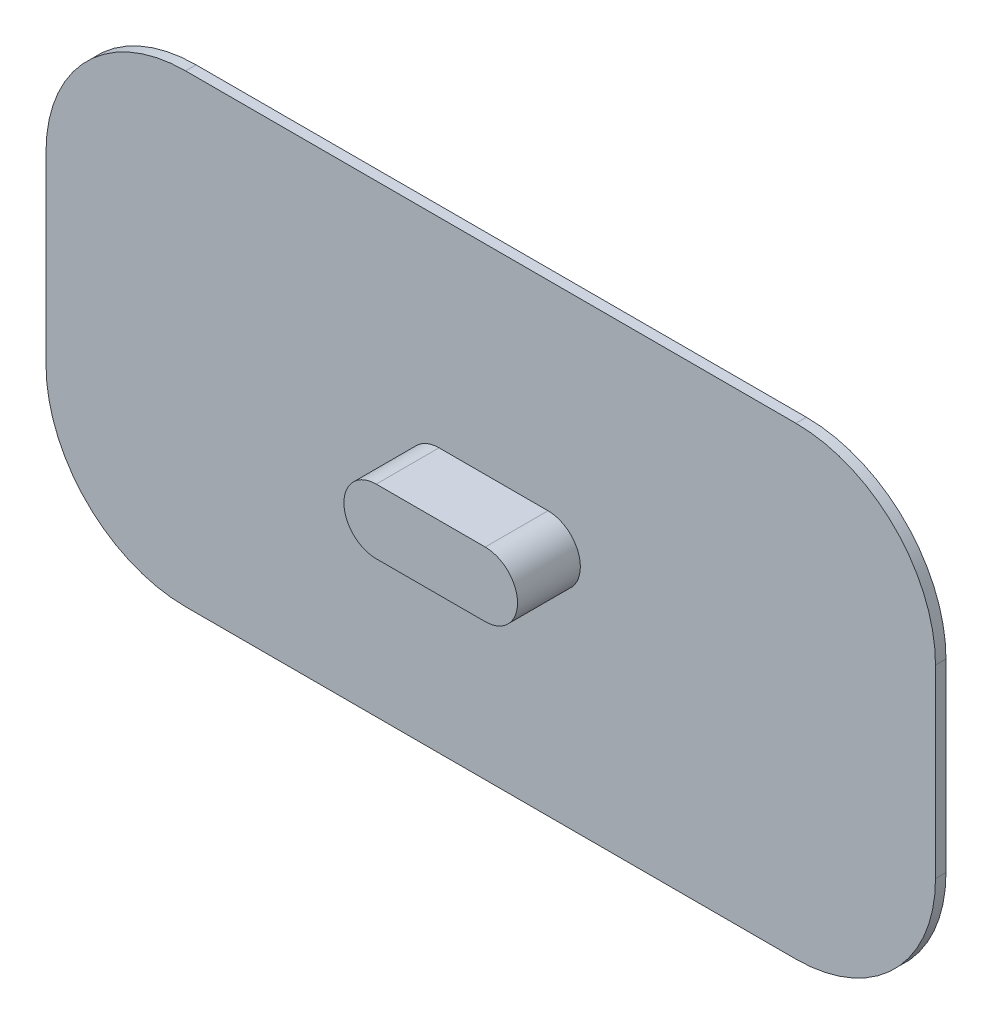
ISO-10303-21;
HEADER;
FILE_DESCRIPTION(('STEP AP214'),'2;1');
FILE_NAME('part.step','',(''),(''),'','','');
FILE_SCHEMA(('AUTOMOTIVE_DESIGN { 1 0 10303 214 1 1 1 1 }'));
ENDSEC;
DATA;
#1=APPLICATION_CONTEXT('core data for automotive mechanical design processes');
#2=APPLICATION_PROTOCOL_DEFINITION('international standard','automotive_design',2000,#1);
#3=PRODUCT_CONTEXT('',#1,'mechanical');
#4=PRODUCT('Part','Part','',(#3));
#5=PRODUCT_RELATED_PRODUCT_CATEGORY('part','',(#4));
#6=PRODUCT_DEFINITION_FORMATION('','',#4);
#7=PRODUCT_DEFINITION_CONTEXT('part definition',#1,'design');
#8=PRODUCT_DEFINITION('design','',#6,#7);
#9=PRODUCT_DEFINITION_SHAPE('','',#8);
#10=(LENGTH_UNIT() NAMED_UNIT(*) SI_UNIT(.MILLI.,.METRE.));
#11=(NAMED_UNIT(*) PLANE_ANGLE_UNIT() SI_UNIT($,.RADIAN.));
#12=(NAMED_UNIT(*) SI_UNIT($,.STERADIAN.) SOLID_ANGLE_UNIT());
#13=UNCERTAINTY_MEASURE_WITH_UNIT(LENGTH_MEASURE(1.E-05),#10,'distance_accuracy_value','');
#14=(GEOMETRIC_REPRESENTATION_CONTEXT(3) GLOBAL_UNCERTAINTY_ASSIGNED_CONTEXT((#13)) GLOBAL_UNIT_ASSIGNED_CONTEXT((#10,
#11,#12)) REPRESENTATION_CONTEXT('',''));
#15=CARTESIAN_POINT('',(0.,0.,0.));
#16=DIRECTION('',(0.,0.,1.));
#17=DIRECTION('',(1.,0.,0.));
#18=AXIS2_PLACEMENT_3D('',#15,#16,#17);
#19=CARTESIAN_POINT('',(-127.45,26.5,3.));
#20=DIRECTION('',(1.,0.,0.));
#21=DIRECTION('',(0.,0.,-1.));
#22=AXIS2_PLACEMENT_3D('',#19,#20,#21);
#23=PLANE('',#22);
#24=DIRECTION('',(0.,-1.,0.));
#25=VECTOR('',#24,1.);
#26=CARTESIAN_POINT('',(-127.45,26.5,0.));
#27=LINE('',#26,#25);
#28=CARTESIAN_POINT('',(-127.45,26.5,0.));
#29=VERTEX_POINT('',#28);
#30=CARTESIAN_POINT('',(-127.45,-26.5,0.));
#31=VERTEX_POINT('',#30);
#32=EDGE_CURVE('E143',#29,#31,#27,.T.);
#33=ORIENTED_EDGE('',*,*,#32,.T.);
#34=DIRECTION('',(0.,0.,-1.));
#35=VECTOR('',#34,1.);
#36=CARTESIAN_POINT('',(-127.45,-26.5,3.));
#37=LINE('',#36,#35);
#38=CARTESIAN_POINT('',(-127.45,-26.5,3.));
#39=VERTEX_POINT('',#38);
#40=EDGE_CURVE('E11',#39,#31,#37,.T.);
#41=ORIENTED_EDGE('',*,*,#40,.F.);
#42=DIRECTION('',(0.,-1.,0.));
#43=VECTOR('',#42,1.);
#44=CARTESIAN_POINT('',(-127.45,26.5,3.));
#45=LINE('',#44,#43);
#46=CARTESIAN_POINT('',(-127.45,26.5,3.));
#47=VERTEX_POINT('',#46);
#48=EDGE_CURVE('E152',#47,#39,#45,.T.);
#49=ORIENTED_EDGE('',*,*,#48,.F.);
#50=DIRECTION('',(0.,0.,-1.));
#51=VECTOR('',#50,1.);
#52=CARTESIAN_POINT('',(-127.45,26.5,3.));
#53=LINE('',#52,#51);
#54=EDGE_CURVE('E169',#47,#29,#53,.T.);
#55=ORIENTED_EDGE('',*,*,#54,.T.);
#56=EDGE_LOOP('',(#33,#41,#49,#55));
#57=FACE_BOUND('',#56,.T.);
#58=ADVANCED_FACE('F35',(#57),#23,.F.);
#59=CARTESIAN_POINT('',(-87.45,-26.5,3.));
#60=DIRECTION('',(0.,0.,-1.));
#61=DIRECTION('',(-1.,0.,0.));
#62=AXIS2_PLACEMENT_3D('',#59,#60,#61);
#63=CYLINDRICAL_SURFACE('',#62,40.);
#64=CARTESIAN_POINT('',(-87.45,-26.5,0.));
#65=DIRECTION('',(0.,0.,1.));
#66=DIRECTION('',(1.,0.,0.));
#67=AXIS2_PLACEMENT_3D('',#64,#65,#66);
#68=CIRCLE('',#67,40.);
#69=CARTESIAN_POINT('',(-87.45,-66.5,0.));
#70=VERTEX_POINT('',#69);
#71=EDGE_CURVE('E146',#31,#70,#68,.T.);
#72=ORIENTED_EDGE('',*,*,#71,.T.);
#73=DIRECTION('',(0.,0.,-1.));
#74=VECTOR('',#73,1.);
#75=CARTESIAN_POINT('',(-87.45,-66.5,3.));
#76=LINE('',#75,#74);
#77=CARTESIAN_POINT('',(-87.45,-66.5,3.));
#78=VERTEX_POINT('',#77);
#79=EDGE_CURVE('E42',#78,#70,#76,.T.);
#80=ORIENTED_EDGE('',*,*,#79,.F.);
#81=CARTESIAN_POINT('',(-87.45,-26.5,3.));
#82=DIRECTION('',(0.,0.,1.));
#83=DIRECTION('',(1.,0.,0.));
#84=AXIS2_PLACEMENT_3D('',#81,#82,#83);
#85=CIRCLE('',#84,40.);
#86=EDGE_CURVE('E155',#39,#78,#85,.T.);
#87=ORIENTED_EDGE('',*,*,#86,.F.);
#88=ORIENTED_EDGE('',*,*,#40,.T.);
#89=EDGE_LOOP('',(#72,#80,#87,#88));
#90=FACE_BOUND('',#89,.T.);
#91=ADVANCED_FACE('F227',(#90),#63,.T.);
#92=CARTESIAN_POINT('',(-87.45,-66.5,3.));
#93=DIRECTION('',(0.,1.,0.));
#94=DIRECTION('',(0.,0.,1.));
#95=AXIS2_PLACEMENT_3D('',#92,#93,#94);
#96=PLANE('',#95);
#97=DIRECTION('',(1.,0.,0.));
#98=VECTOR('',#97,1.);
#99=CARTESIAN_POINT('',(-87.45,-66.5,0.));
#100=LINE('',#99,#98);
#101=CARTESIAN_POINT('',(87.45,-66.5,0.));
#102=VERTEX_POINT('',#101);
#103=EDGE_CURVE('E172',#70,#102,#100,.T.);
#104=ORIENTED_EDGE('',*,*,#103,.T.);
#105=DIRECTION('',(0.,0.,-1.));
#106=VECTOR('',#105,1.);
#107=CARTESIAN_POINT('',(87.45,-66.5,3.));
#108=LINE('',#107,#106);
#109=CARTESIAN_POINT('',(87.45,-66.5,3.));
#110=VERTEX_POINT('',#109);
#111=EDGE_CURVE('E197',#110,#102,#108,.T.);
#112=ORIENTED_EDGE('',*,*,#111,.F.);
#113=DIRECTION('',(1.,0.,0.));
#114=VECTOR('',#113,1.);
#115=CARTESIAN_POINT('',(-87.45,-66.5,3.));
#116=LINE('',#115,#114);
#117=EDGE_CURVE('E158',#78,#110,#116,.T.);
#118=ORIENTED_EDGE('',*,*,#117,.F.);
#119=ORIENTED_EDGE('',*,*,#79,.T.);
#120=EDGE_LOOP('',(#104,#112,#118,#119));
#121=FACE_BOUND('',#120,.T.);
#122=ADVANCED_FACE('F204',(#121),#96,.F.);
#123=CARTESIAN_POINT('',(87.45,-26.5,3.));
#124=DIRECTION('',(0.,0.,-1.));
#125=DIRECTION('',(-1.,0.,0.));
#126=AXIS2_PLACEMENT_3D('',#123,#124,#125);
#127=CYLINDRICAL_SURFACE('',#126,40.);
#128=CARTESIAN_POINT('',(87.45,-26.5,0.));
#129=DIRECTION('',(0.,0.,1.));
#130=DIRECTION('',(1.,0.,0.));
#131=AXIS2_PLACEMENT_3D('',#128,#129,#130);
#132=CIRCLE('',#131,40.);
#133=CARTESIAN_POINT('',(127.45,-26.5,0.));
#134=VERTEX_POINT('',#133);
#135=EDGE_CURVE('E174',#102,#134,#132,.T.);
#136=ORIENTED_EDGE('',*,*,#135,.T.);
#137=DIRECTION('',(0.,0.,-1.));
#138=VECTOR('',#137,1.);
#139=CARTESIAN_POINT('',(127.45,-26.5,3.));
#140=LINE('',#139,#138);
#141=CARTESIAN_POINT('',(127.45,-26.5,3.));
#142=VERTEX_POINT('',#141);
#143=EDGE_CURVE('E194',#142,#134,#140,.T.);
#144=ORIENTED_EDGE('',*,*,#143,.F.);
#145=CARTESIAN_POINT('',(87.45,-26.5,3.));
#146=DIRECTION('',(0.,0.,1.));
#147=DIRECTION('',(1.,0.,0.));
#148=AXIS2_PLACEMENT_3D('',#145,#146,#147);
#149=CIRCLE('',#148,40.);
#150=EDGE_CURVE('E160',#110,#142,#149,.T.);
#151=ORIENTED_EDGE('',*,*,#150,.F.);
#152=ORIENTED_EDGE('',*,*,#111,.T.);
#153=EDGE_LOOP('',(#136,#144,#151,#152));
#154=FACE_BOUND('',#153,.T.);
#155=ADVANCED_FACE('F215',(#154),#127,.T.);
#156=CARTESIAN_POINT('',(127.45,-26.5,3.));
#157=DIRECTION('',(-1.,0.,0.));
#158=DIRECTION('',(0.,0.,1.));
#159=AXIS2_PLACEMENT_3D('',#156,#157,#158);
#160=PLANE('',#159);
#161=DIRECTION('',(0.,1.,0.));
#162=VECTOR('',#161,1.);
#163=CARTESIAN_POINT('',(127.45,-26.5,0.));
#164=LINE('',#163,#162);
#165=CARTESIAN_POINT('',(127.45,26.5,0.));
#166=VERTEX_POINT('',#165);
#167=EDGE_CURVE('E176',#134,#166,#164,.T.);
#168=ORIENTED_EDGE('',*,*,#167,.T.);
#169=DIRECTION('',(0.,0.,-1.));
#170=VECTOR('',#169,1.);
#171=CARTESIAN_POINT('',(127.45,26.5,3.));
#172=LINE('',#171,#170);
#173=CARTESIAN_POINT('',(127.45,26.5,3.));
#174=VERTEX_POINT('',#173);
#175=EDGE_CURVE('E191',#174,#166,#172,.T.);
#176=ORIENTED_EDGE('',*,*,#175,.F.);
#177=DIRECTION('',(0.,1.,0.));
#178=VECTOR('',#177,1.);
#179=CARTESIAN_POINT('',(127.45,-26.5,3.));
#180=LINE('',#179,#178);
#181=EDGE_CURVE('E162',#142,#174,#180,.T.);
#182=ORIENTED_EDGE('',*,*,#181,.F.);
#183=ORIENTED_EDGE('',*,*,#143,.T.);
#184=EDGE_LOOP('',(#168,#176,#182,#183));
#185=FACE_BOUND('',#184,.T.);
#186=ADVANCED_FACE('F219',(#185),#160,.F.);
#187=CARTESIAN_POINT('',(87.45,26.5,3.));
#188=DIRECTION('',(0.,0.,-1.));
#189=DIRECTION('',(-1.,0.,0.));
#190=AXIS2_PLACEMENT_3D('',#187,#188,#189);
#191=CYLINDRICAL_SURFACE('',#190,40.);
#192=CARTESIAN_POINT('',(87.45,26.5,0.));
#193=DIRECTION('',(0.,0.,1.));
#194=DIRECTION('',(1.,0.,0.));
#195=AXIS2_PLACEMENT_3D('',#192,#193,#194);
#196=CIRCLE('',#195,40.);
#197=CARTESIAN_POINT('',(87.45,66.5,0.));
#198=VERTEX_POINT('',#197);
#199=EDGE_CURVE('E178',#166,#198,#196,.T.);
#200=ORIENTED_EDGE('',*,*,#199,.T.);
#201=DIRECTION('',(0.,0.,-1.));
#202=VECTOR('',#201,1.);
#203=CARTESIAN_POINT('',(87.45,66.5,3.));
#204=LINE('',#203,#202);
#205=CARTESIAN_POINT('',(87.45,66.5,3.));
#206=VERTEX_POINT('',#205);
#207=EDGE_CURVE('E188',#206,#198,#204,.T.);
#208=ORIENTED_EDGE('',*,*,#207,.F.);
#209=CARTESIAN_POINT('',(87.45,26.5,3.));
#210=DIRECTION('',(0.,0.,1.));
#211=DIRECTION('',(1.,0.,0.));
#212=AXIS2_PLACEMENT_3D('',#209,#210,#211);
#213=CIRCLE('',#212,40.);
#214=EDGE_CURVE('E164',#174,#206,#213,.T.);
#215=ORIENTED_EDGE('',*,*,#214,.F.);
#216=ORIENTED_EDGE('',*,*,#175,.T.);
#217=EDGE_LOOP('',(#200,#208,#215,#216));
#218=FACE_BOUND('',#217,.T.);
#219=ADVANCED_FACE('F240',(#218),#191,.T.);
#220=CARTESIAN_POINT('',(87.45,66.5,3.));
#221=DIRECTION('',(0.,-1.,0.));
#222=DIRECTION('',(0.,0.,-1.));
#223=AXIS2_PLACEMENT_3D('',#220,#221,#222);
#224=PLANE('',#223);
#225=DIRECTION('',(-1.,0.,0.));
#226=VECTOR('',#225,1.);
#227=CARTESIAN_POINT('',(87.45,66.5,0.));
#228=LINE('',#227,#226);
#229=CARTESIAN_POINT('',(-87.45,66.5,0.));
#230=VERTEX_POINT('',#229);
#231=EDGE_CURVE('E180',#198,#230,#228,.T.);
#232=ORIENTED_EDGE('',*,*,#231,.T.);
#233=DIRECTION('',(0.,0.,-1.));
#234=VECTOR('',#233,1.);
#235=CARTESIAN_POINT('',(-87.45,66.5,3.));
#236=LINE('',#235,#234);
#237=CARTESIAN_POINT('',(-87.45,66.5,3.));
#238=VERTEX_POINT('',#237);
#239=EDGE_CURVE('E185',#238,#230,#236,.T.);
#240=ORIENTED_EDGE('',*,*,#239,.F.);
#241=DIRECTION('',(-1.,0.,0.));
#242=VECTOR('',#241,1.);
#243=CARTESIAN_POINT('',(87.45,66.5,3.));
#244=LINE('',#243,#242);
#245=EDGE_CURVE('E166',#206,#238,#244,.T.);
#246=ORIENTED_EDGE('',*,*,#245,.F.);
#247=ORIENTED_EDGE('',*,*,#207,.T.);
#248=EDGE_LOOP('',(#232,#240,#246,#247));
#249=FACE_BOUND('',#248,.T.);
#250=ADVANCED_FACE('F238',(#249),#224,.F.);
#251=CARTESIAN_POINT('',(-87.45,26.5,3.));
#252=DIRECTION('',(0.,0.,-1.));
#253=DIRECTION('',(-1.,0.,0.));
#254=AXIS2_PLACEMENT_3D('',#251,#252,#253);
#255=CYLINDRICAL_SURFACE('',#254,40.);
#256=CARTESIAN_POINT('',(-87.45,26.5,0.));
#257=DIRECTION('',(0.,0.,1.));
#258=DIRECTION('',(1.,0.,0.));
#259=AXIS2_PLACEMENT_3D('',#256,#257,#258);
#260=CIRCLE('',#259,40.);
#261=EDGE_CURVE('E156',#230,#29,#260,.T.);
#262=ORIENTED_EDGE('',*,*,#261,.T.);
#263=ORIENTED_EDGE('',*,*,#54,.F.);
#264=CARTESIAN_POINT('',(-87.45,26.5,3.));
#265=DIRECTION('',(0.,0.,1.));
#266=DIRECTION('',(1.,0.,0.));
#267=AXIS2_PLACEMENT_3D('',#264,#265,#266);
#268=CIRCLE('',#267,40.);
#269=EDGE_CURVE('E168',#238,#47,#268,.T.);
#270=ORIENTED_EDGE('',*,*,#269,.F.);
#271=ORIENTED_EDGE('',*,*,#239,.T.);
#272=EDGE_LOOP('',(#262,#263,#270,#271));
#273=FACE_BOUND('',#272,.T.);
#274=ADVANCED_FACE('F233',(#273),#255,.T.);
#275=CARTESIAN_POINT('',(-87.45,-26.5,3.));
#276=DIRECTION('',(0.,0.,1.));
#277=DIRECTION('',(1.,0.,0.));
#278=AXIS2_PLACEMENT_3D('',#275,#276,#277);
#279=PLANE('',#278);
#280=CARTESIAN_POINT('',(-14.8218267329379,0.,3.));
#281=DIRECTION('',(0.,0.,1.));
#282=DIRECTION('',(1.,0.,0.));
#283=AXIS2_PLACEMENT_3D('',#280,#281,#282);
#284=CIRCLE('',#283,9.26364170808615);
#285=CARTESIAN_POINT('',(-14.8218267329379,9.26364170808615,3.));
#286=VERTEX_POINT('',#285);
#287=CARTESIAN_POINT('',(-14.8218267329379,-9.26364170808615,3.));
#288=VERTEX_POINT('',#287);
#289=EDGE_CURVE('E49',#286,#288,#284,.T.);
#290=ORIENTED_EDGE('',*,*,#289,.F.);
#291=DIRECTION('',(-1.,0.,0.));
#292=VECTOR('',#291,1.);
#293=CARTESIAN_POINT('',(-14.8218267329379,9.26364170808615,3.));
#294=LINE('',#293,#292);
#295=CARTESIAN_POINT('',(16.4098795971812,9.26364170808615,3.));
#296=VERTEX_POINT('',#295);
#297=EDGE_CURVE('E53',#296,#286,#294,.T.);
#298=ORIENTED_EDGE('',*,*,#297,.F.);
#299=CARTESIAN_POINT('',(16.4098795971812,0.,3.));
#300=DIRECTION('',(0.,0.,1.));
#301=DIRECTION('',(1.,0.,0.));
#302=AXIS2_PLACEMENT_3D('',#299,#300,#301);
#303=CIRCLE('',#302,9.26364170808615);
#304=CARTESIAN_POINT('',(16.4098795971812,-9.26364170808615,3.));
#305=VERTEX_POINT('',#304);
#306=EDGE_CURVE('E352',#305,#296,#303,.T.);
#307=ORIENTED_EDGE('',*,*,#306,.F.);
#308=DIRECTION('',(1.,0.,0.));
#309=VECTOR('',#308,1.);
#310=CARTESIAN_POINT('',(-14.8218267329379,-9.26364170808615,3.));
#311=LINE('',#310,#309);
#312=EDGE_CURVE('E358',#288,#305,#311,.T.);
#313=ORIENTED_EDGE('',*,*,#312,.F.);
#314=EDGE_LOOP('',(#290,#298,#307,#313));
#315=FACE_BOUND('',#314,.T.);
#316=ORIENTED_EDGE('',*,*,#48,.T.);
#317=ORIENTED_EDGE('',*,*,#86,.T.);
#318=ORIENTED_EDGE('',*,*,#117,.T.);
#319=ORIENTED_EDGE('',*,*,#150,.T.);
#320=ORIENTED_EDGE('',*,*,#181,.T.);
#321=ORIENTED_EDGE('',*,*,#214,.T.);
#322=ORIENTED_EDGE('',*,*,#245,.T.);
#323=ORIENTED_EDGE('',*,*,#269,.T.);
#324=EDGE_LOOP('',(#316,#317,#318,#319,#320,#321,#322,#323));
#325=FACE_BOUND('',#324,.T.);
#326=ADVANCED_FACE('F223',(#315,#325),#279,.T.);
#327=CARTESIAN_POINT('',(-87.45,-26.5,0.));
#328=DIRECTION('',(0.,0.,1.));
#329=DIRECTION('',(1.,0.,0.));
#330=AXIS2_PLACEMENT_3D('',#327,#328,#329);
#331=PLANE('',#330);
#332=ORIENTED_EDGE('',*,*,#32,.F.);
#333=ORIENTED_EDGE('',*,*,#261,.F.);
#334=ORIENTED_EDGE('',*,*,#231,.F.);
#335=ORIENTED_EDGE('',*,*,#199,.F.);
#336=ORIENTED_EDGE('',*,*,#167,.F.);
#337=ORIENTED_EDGE('',*,*,#135,.F.);
#338=ORIENTED_EDGE('',*,*,#103,.F.);
#339=ORIENTED_EDGE('',*,*,#71,.F.);
#340=EDGE_LOOP('',(#332,#333,#334,#335,#336,#337,#338,#339));
#341=FACE_BOUND('',#340,.T.);
#342=ADVANCED_FACE('F210',(#341),#331,.F.);
#343=CARTESIAN_POINT('',(-14.8218267329379,0.,21.));
#344=DIRECTION('',(0.,0.,-1.));
#345=DIRECTION('',(-1.,0.,0.));
#346=AXIS2_PLACEMENT_3D('',#343,#344,#345);
#347=CYLINDRICAL_SURFACE('',#346,9.26364170808615);
#348=ORIENTED_EDGE('',*,*,#289,.T.);
#349=DIRECTION('',(0.,0.,-1.));
#350=VECTOR('',#349,1.);
#351=CARTESIAN_POINT('',(-14.8218267329379,-9.26364170808615,21.));
#352=LINE('',#351,#350);
#353=CARTESIAN_POINT('',(-14.8218267329379,-9.26364170808615,21.));
#354=VERTEX_POINT('',#353);
#355=EDGE_CURVE('E126',#354,#288,#352,.T.);
#356=ORIENTED_EDGE('',*,*,#355,.F.);
#357=CARTESIAN_POINT('',(-14.8218267329379,0.,21.));
#358=DIRECTION('',(0.,0.,1.));
#359=DIRECTION('',(1.,0.,0.));
#360=AXIS2_PLACEMENT_3D('',#357,#358,#359);
#361=CIRCLE('',#360,9.26364170808615);
#362=CARTESIAN_POINT('',(-14.8218267329379,9.26364170808615,21.));
#363=VERTEX_POINT('',#362);
#364=EDGE_CURVE('E132',#363,#354,#361,.T.);
#365=ORIENTED_EDGE('',*,*,#364,.F.);
#366=DIRECTION('',(0.,0.,-1.));
#367=VECTOR('',#366,1.);
#368=CARTESIAN_POINT('',(-14.8218267329379,9.26364170808615,21.));
#369=LINE('',#368,#367);
#370=EDGE_CURVE('E350',#363,#286,#369,.T.);
#371=ORIENTED_EDGE('',*,*,#370,.T.);
#372=EDGE_LOOP('',(#348,#356,#365,#371));
#373=FACE_BOUND('',#372,.T.);
#374=ADVANCED_FACE('F142',(#373),#347,.T.);
#375=CARTESIAN_POINT('',(-14.8218267329379,-9.26364170808615,21.));
#376=DIRECTION('',(0.,1.,0.));
#377=DIRECTION('',(0.,0.,1.));
#378=AXIS2_PLACEMENT_3D('',#375,#376,#377);
#379=PLANE('',#378);
#380=ORIENTED_EDGE('',*,*,#312,.T.);
#381=DIRECTION('',(0.,0.,-1.));
#382=VECTOR('',#381,1.);
#383=CARTESIAN_POINT('',(16.4098795971812,-9.26364170808615,21.));
#384=LINE('',#383,#382);
#385=CARTESIAN_POINT('',(16.4098795971812,-9.26364170808615,21.));
#386=VERTEX_POINT('',#385);
#387=EDGE_CURVE('E128',#386,#305,#384,.T.);
#388=ORIENTED_EDGE('',*,*,#387,.F.);
#389=DIRECTION('',(1.,0.,0.));
#390=VECTOR('',#389,1.);
#391=CARTESIAN_POINT('',(-14.8218267329379,-9.26364170808615,21.));
#392=LINE('',#391,#390);
#393=EDGE_CURVE('E121',#354,#386,#392,.T.);
#394=ORIENTED_EDGE('',*,*,#393,.F.);
#395=ORIENTED_EDGE('',*,*,#355,.T.);
#396=EDGE_LOOP('',(#380,#388,#394,#395));
#397=FACE_BOUND('',#396,.T.);
#398=ADVANCED_FACE('F124',(#397),#379,.F.);
#399=CARTESIAN_POINT('',(16.4098795971812,0.,21.));
#400=DIRECTION('',(0.,0.,-1.));
#401=DIRECTION('',(-1.,0.,0.));
#402=AXIS2_PLACEMENT_3D('',#399,#400,#401);
#403=CYLINDRICAL_SURFACE('',#402,9.26364170808615);
#404=ORIENTED_EDGE('',*,*,#306,.T.);
#405=DIRECTION('',(0.,0.,-1.));
#406=VECTOR('',#405,1.);
#407=CARTESIAN_POINT('',(16.4098795971812,9.26364170808615,21.));
#408=LINE('',#407,#406);
#409=CARTESIAN_POINT('',(16.4098795971812,9.26364170808615,21.));
#410=VERTEX_POINT('',#409);
#411=EDGE_CURVE('E148',#410,#296,#408,.T.);
#412=ORIENTED_EDGE('',*,*,#411,.F.);
#413=CARTESIAN_POINT('',(16.4098795971812,0.,21.));
#414=DIRECTION('',(0.,0.,1.));
#415=DIRECTION('',(1.,0.,0.));
#416=AXIS2_PLACEMENT_3D('',#413,#414,#415);
#417=CIRCLE('',#416,9.26364170808615);
#418=EDGE_CURVE('E131',#386,#410,#417,.T.);
#419=ORIENTED_EDGE('',*,*,#418,.F.);
#420=ORIENTED_EDGE('',*,*,#387,.T.);
#421=EDGE_LOOP('',(#404,#412,#419,#420));
#422=FACE_BOUND('',#421,.T.);
#423=ADVANCED_FACE('F318',(#422),#403,.T.);
#424=CARTESIAN_POINT('',(-14.8218267329379,9.26364170808615,21.));
#425=DIRECTION('',(0.,-1.,0.));
#426=DIRECTION('',(0.,0.,-1.));
#427=AXIS2_PLACEMENT_3D('',#424,#425,#426);
#428=PLANE('',#427);
#429=ORIENTED_EDGE('',*,*,#297,.T.);
#430=ORIENTED_EDGE('',*,*,#370,.F.);
#431=DIRECTION('',(-1.,0.,0.));
#432=VECTOR('',#431,1.);
#433=CARTESIAN_POINT('',(-14.8218267329379,9.26364170808615,21.));
#434=LINE('',#433,#432);
#435=EDGE_CURVE('E137',#410,#363,#434,.T.);
#436=ORIENTED_EDGE('',*,*,#435,.F.);
#437=ORIENTED_EDGE('',*,*,#411,.T.);
#438=EDGE_LOOP('',(#429,#430,#436,#437));
#439=FACE_BOUND('',#438,.T.);
#440=ADVANCED_FACE('F327',(#439),#428,.F.);
#441=CARTESIAN_POINT('',(-14.8218267329379,0.,21.));
#442=DIRECTION('',(0.,0.,1.));
#443=DIRECTION('',(1.,0.,0.));
#444=AXIS2_PLACEMENT_3D('',#441,#442,#443);
#445=PLANE('',#444);
#446=ORIENTED_EDGE('',*,*,#364,.T.);
#447=ORIENTED_EDGE('',*,*,#393,.T.);
#448=ORIENTED_EDGE('',*,*,#418,.T.);
#449=ORIENTED_EDGE('',*,*,#435,.T.);
#450=EDGE_LOOP('',(#446,#447,#448,#449));
#451=FACE_BOUND('',#450,.T.);
#452=ADVANCED_FACE('F135',(#451),#445,.T.);
#453=CLOSED_SHELL('',(#58,#91,#122,#155,#186,#219,#250,#274,#326,#342,#374,#398,#423,#440,#452));
#454=MANIFOLD_SOLID_BREP('B2',#453);
#455=ADVANCED_BREP_SHAPE_REPRESENTATION('',(#18,#454),#14);
#456=SHAPE_DEFINITION_REPRESENTATION(#9,#455);
ENDSEC;
END-ISO-10303-21;
